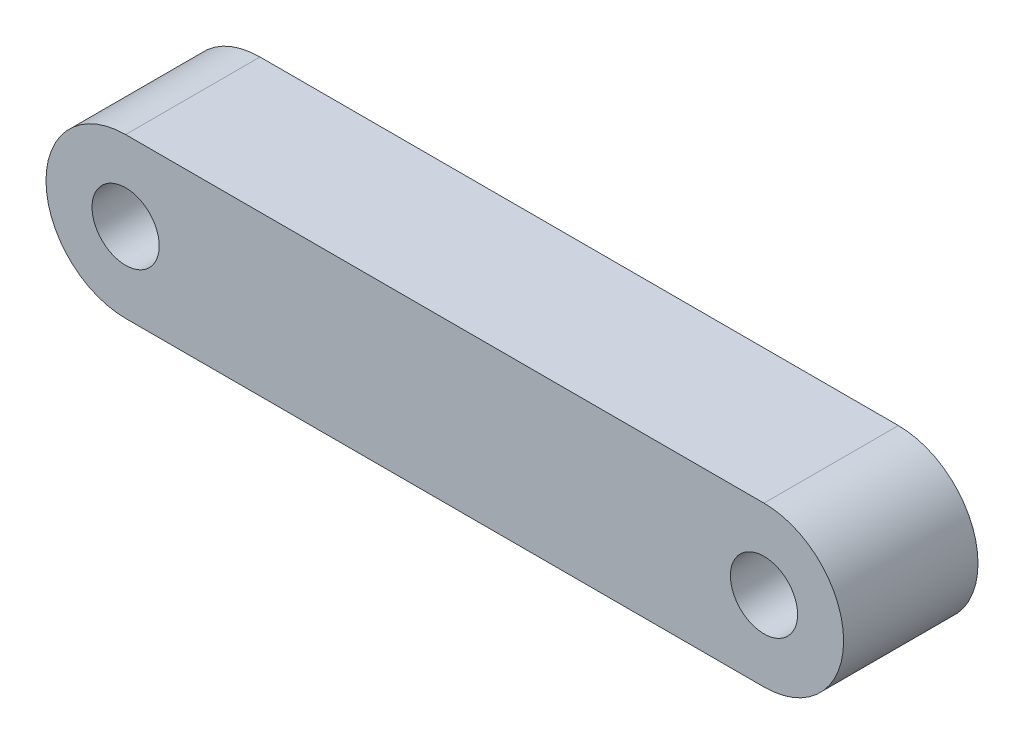
ISO-10303-21;
HEADER;
FILE_DESCRIPTION(('STEP AP214'),'2;1');
FILE_NAME('part.step','',(''),(''),'','','');
FILE_SCHEMA(('AUTOMOTIVE_DESIGN { 1 0 10303 214 1 1 1 1 }'));
ENDSEC;
DATA;
#1=APPLICATION_CONTEXT('core data for automotive mechanical design processes');
#2=APPLICATION_PROTOCOL_DEFINITION('international standard','automotive_design',2000,#1);
#3=PRODUCT_CONTEXT('',#1,'mechanical');
#4=PRODUCT('Part','Part','',(#3));
#5=PRODUCT_RELATED_PRODUCT_CATEGORY('part','',(#4));
#6=PRODUCT_DEFINITION_FORMATION('','',#4);
#7=PRODUCT_DEFINITION_CONTEXT('part definition',#1,'design');
#8=PRODUCT_DEFINITION('design','',#6,#7);
#9=PRODUCT_DEFINITION_SHAPE('','',#8);
#10=(LENGTH_UNIT() NAMED_UNIT(*) SI_UNIT(.MILLI.,.METRE.));
#11=(NAMED_UNIT(*) PLANE_ANGLE_UNIT() SI_UNIT($,.RADIAN.));
#12=(NAMED_UNIT(*) SI_UNIT($,.STERADIAN.) SOLID_ANGLE_UNIT());
#13=UNCERTAINTY_MEASURE_WITH_UNIT(LENGTH_MEASURE(1.E-05),#10,'distance_accuracy_value','');
#14=(GEOMETRIC_REPRESENTATION_CONTEXT(3) GLOBAL_UNCERTAINTY_ASSIGNED_CONTEXT((#13)) GLOBAL_UNIT_ASSIGNED_CONTEXT((#10,
#11,#12)) REPRESENTATION_CONTEXT('',''));
#15=CARTESIAN_POINT('',(0.,0.,0.));
#16=DIRECTION('',(0.,0.,1.));
#17=DIRECTION('',(1.,0.,0.));
#18=AXIS2_PLACEMENT_3D('',#15,#16,#17);
#19=CARTESIAN_POINT('',(-9.07346938775511,0.,4.));
#20=DIRECTION('',(0.,0.,1.));
#21=DIRECTION('',(1.,0.,0.));
#22=AXIS2_PLACEMENT_3D('',#19,#20,#21);
#23=PLANE('',#22);
#24=CARTESIAN_POINT('',(9.92653061224489,0.,4.));
#25=DIRECTION('',(0.,0.,1.));
#26=DIRECTION('',(1.,0.,0.));
#27=AXIS2_PLACEMENT_3D('',#24,#25,#26);
#28=CIRCLE('',#27,1.);
#29=CARTESIAN_POINT('',(10.9265306122449,0.,4.));
#30=VERTEX_POINT('',#29);
#31=EDGE_CURVE('E100',#30,#30,#28,.T.);
#32=ORIENTED_EDGE('',*,*,#31,.F.);
#33=EDGE_LOOP('',(#32));
#34=FACE_BOUND('',#33,.T.);
#35=CARTESIAN_POINT('',(-9.07346938775511,0.,4.));
#36=DIRECTION('',(0.,0.,1.));
#37=DIRECTION('',(1.,0.,0.));
#38=AXIS2_PLACEMENT_3D('',#35,#36,#37);
#39=CIRCLE('',#38,2.37);
#40=CARTESIAN_POINT('',(-9.07346938775511,2.37,4.));
#41=VERTEX_POINT('',#40);
#42=CARTESIAN_POINT('',(-9.07346938775511,-2.37,4.));
#43=VERTEX_POINT('',#42);
#44=EDGE_CURVE('E85',#41,#43,#39,.T.);
#45=ORIENTED_EDGE('',*,*,#44,.T.);
#46=DIRECTION('',(1.,0.,0.));
#47=VECTOR('',#46,1.);
#48=CARTESIAN_POINT('',(-9.07346938775511,-2.37,4.));
#49=LINE('',#48,#47);
#50=CARTESIAN_POINT('',(9.92653061224489,-2.37,4.));
#51=VERTEX_POINT('',#50);
#52=EDGE_CURVE('E80',#43,#51,#49,.T.);
#53=ORIENTED_EDGE('',*,*,#52,.T.);
#54=CARTESIAN_POINT('',(9.92653061224489,0.,4.));
#55=DIRECTION('',(0.,0.,1.));
#56=DIRECTION('',(1.,0.,0.));
#57=AXIS2_PLACEMENT_3D('',#54,#55,#56);
#58=CIRCLE('',#57,2.37);
#59=CARTESIAN_POINT('',(9.92653061224489,2.37,4.));
#60=VERTEX_POINT('',#59);
#61=EDGE_CURVE('E83',#51,#60,#58,.T.);
#62=ORIENTED_EDGE('',*,*,#61,.T.);
#63=DIRECTION('',(-1.,0.,0.));
#64=VECTOR('',#63,1.);
#65=CARTESIAN_POINT('',(-9.07346938775511,2.37,4.));
#66=LINE('',#65,#64);
#67=EDGE_CURVE('E50',#60,#41,#66,.T.);
#68=ORIENTED_EDGE('',*,*,#67,.T.);
#69=EDGE_LOOP('',(#45,#53,#62,#68));
#70=FACE_BOUND('',#69,.T.);
#71=CARTESIAN_POINT('',(-9.07346938775511,0.,4.));
#72=DIRECTION('',(0.,0.,1.));
#73=DIRECTION('',(1.,0.,0.));
#74=AXIS2_PLACEMENT_3D('',#71,#72,#73);
#75=CIRCLE('',#74,1.);
#76=CARTESIAN_POINT('',(-8.07346938775511,0.,4.));
#77=VERTEX_POINT('',#76);
#78=EDGE_CURVE('E115',#77,#77,#75,.T.);
#79=ORIENTED_EDGE('',*,*,#78,.F.);
#80=EDGE_LOOP('',(#79));
#81=FACE_BOUND('',#80,.T.);
#82=ADVANCED_FACE('F33',(#34,#70,#81),#23,.T.);
#83=CARTESIAN_POINT('',(-9.07346938775511,0.,0.));
#84=DIRECTION('',(0.,0.,1.));
#85=DIRECTION('',(1.,0.,0.));
#86=AXIS2_PLACEMENT_3D('',#83,#84,#85);
#87=PLANE('',#86);
#88=CARTESIAN_POINT('',(-9.07346938775511,0.,0.));
#89=DIRECTION('',(0.,0.,1.));
#90=DIRECTION('',(1.,0.,0.));
#91=AXIS2_PLACEMENT_3D('',#88,#89,#90);
#92=CIRCLE('',#91,2.37);
#93=CARTESIAN_POINT('',(-9.07346938775511,2.37,0.));
#94=VERTEX_POINT('',#93);
#95=CARTESIAN_POINT('',(-9.07346938775511,-2.37,0.));
#96=VERTEX_POINT('',#95);
#97=EDGE_CURVE('E97',#94,#96,#92,.T.);
#98=ORIENTED_EDGE('',*,*,#97,.F.);
#99=DIRECTION('',(-1.,0.,0.));
#100=VECTOR('',#99,1.);
#101=CARTESIAN_POINT('',(-9.07346938775511,2.37,0.));
#102=LINE('',#101,#100);
#103=CARTESIAN_POINT('',(9.92653061224489,2.37,0.));
#104=VERTEX_POINT('',#103);
#105=EDGE_CURVE('E73',#104,#94,#102,.T.);
#106=ORIENTED_EDGE('',*,*,#105,.F.);
#107=CARTESIAN_POINT('',(9.92653061224489,0.,0.));
#108=DIRECTION('',(0.,0.,1.));
#109=DIRECTION('',(1.,0.,0.));
#110=AXIS2_PLACEMENT_3D('',#107,#108,#109);
#111=CIRCLE('',#110,2.37);
#112=CARTESIAN_POINT('',(9.92653061224489,-2.37,0.));
#113=VERTEX_POINT('',#112);
#114=EDGE_CURVE('E67',#113,#104,#111,.T.);
#115=ORIENTED_EDGE('',*,*,#114,.F.);
#116=DIRECTION('',(1.,0.,0.));
#117=VECTOR('',#116,1.);
#118=CARTESIAN_POINT('',(-9.07346938775511,-2.37,0.));
#119=LINE('',#118,#117);
#120=EDGE_CURVE('E89',#96,#113,#119,.T.);
#121=ORIENTED_EDGE('',*,*,#120,.F.);
#122=EDGE_LOOP('',(#98,#106,#115,#121));
#123=FACE_BOUND('',#122,.T.);
#124=CARTESIAN_POINT('',(9.92653061224489,0.,0.));
#125=DIRECTION('',(0.,0.,1.));
#126=DIRECTION('',(1.,0.,0.));
#127=AXIS2_PLACEMENT_3D('',#124,#125,#126);
#128=CIRCLE('',#127,1.);
#129=CARTESIAN_POINT('',(10.9265306122449,0.,0.));
#130=VERTEX_POINT('',#129);
#131=EDGE_CURVE('E112',#130,#130,#128,.T.);
#132=ORIENTED_EDGE('',*,*,#131,.T.);
#133=EDGE_LOOP('',(#132));
#134=FACE_BOUND('',#133,.T.);
#135=CARTESIAN_POINT('',(-9.07346938775511,0.,0.));
#136=DIRECTION('',(0.,0.,1.));
#137=DIRECTION('',(1.,0.,0.));
#138=AXIS2_PLACEMENT_3D('',#135,#136,#137);
#139=CIRCLE('',#138,1.);
#140=CARTESIAN_POINT('',(-8.07346938775511,0.,0.));
#141=VERTEX_POINT('',#140);
#142=EDGE_CURVE('E118',#141,#141,#139,.T.);
#143=ORIENTED_EDGE('',*,*,#142,.T.);
#144=EDGE_LOOP('',(#143));
#145=FACE_BOUND('',#144,.T.);
#146=ADVANCED_FACE('F108',(#123,#134,#145),#87,.F.);
#147=CARTESIAN_POINT('',(-9.07346938775511,0.,4.));
#148=DIRECTION('',(0.,0.,-1.));
#149=DIRECTION('',(-1.,0.,0.));
#150=AXIS2_PLACEMENT_3D('',#147,#148,#149);
#151=CYLINDRICAL_SURFACE('',#150,2.37);
#152=ORIENTED_EDGE('',*,*,#97,.T.);
#153=DIRECTION('',(0.,0.,-1.));
#154=VECTOR('',#153,1.);
#155=CARTESIAN_POINT('',(-9.07346938775511,-2.37,4.));
#156=LINE('',#155,#154);
#157=EDGE_CURVE('E11',#43,#96,#156,.T.);
#158=ORIENTED_EDGE('',*,*,#157,.F.);
#159=ORIENTED_EDGE('',*,*,#44,.F.);
#160=DIRECTION('',(0.,0.,-1.));
#161=VECTOR('',#160,1.);
#162=CARTESIAN_POINT('',(-9.07346938775511,2.37,4.));
#163=LINE('',#162,#161);
#164=EDGE_CURVE('E93',#41,#94,#163,.T.);
#165=ORIENTED_EDGE('',*,*,#164,.T.);
#166=EDGE_LOOP('',(#152,#158,#159,#165));
#167=FACE_BOUND('',#166,.T.);
#168=ADVANCED_FACE('F35',(#167),#151,.T.);
#169=CARTESIAN_POINT('',(-9.07346938775511,-2.37,4.));
#170=DIRECTION('',(0.,1.,0.));
#171=DIRECTION('',(0.,0.,1.));
#172=AXIS2_PLACEMENT_3D('',#169,#170,#171);
#173=PLANE('',#172);
#174=ORIENTED_EDGE('',*,*,#120,.T.);
#175=DIRECTION('',(0.,0.,-1.));
#176=VECTOR('',#175,1.);
#177=CARTESIAN_POINT('',(9.92653061224489,-2.37,4.));
#178=LINE('',#177,#176);
#179=EDGE_CURVE('E42',#51,#113,#178,.T.);
#180=ORIENTED_EDGE('',*,*,#179,.F.);
#181=ORIENTED_EDGE('',*,*,#52,.F.);
#182=ORIENTED_EDGE('',*,*,#157,.T.);
#183=EDGE_LOOP('',(#174,#180,#181,#182));
#184=FACE_BOUND('',#183,.T.);
#185=ADVANCED_FACE('F88',(#184),#173,.F.);
#186=CARTESIAN_POINT('',(9.92653061224489,0.,4.));
#187=DIRECTION('',(0.,0.,-1.));
#188=DIRECTION('',(-1.,0.,0.));
#189=AXIS2_PLACEMENT_3D('',#186,#187,#188);
#190=CYLINDRICAL_SURFACE('',#189,2.37);
#191=ORIENTED_EDGE('',*,*,#114,.T.);
#192=DIRECTION('',(0.,0.,-1.));
#193=VECTOR('',#192,1.);
#194=CARTESIAN_POINT('',(9.92653061224489,2.37,4.));
#195=LINE('',#194,#193);
#196=EDGE_CURVE('E90',#60,#104,#195,.T.);
#197=ORIENTED_EDGE('',*,*,#196,.F.);
#198=ORIENTED_EDGE('',*,*,#61,.F.);
#199=ORIENTED_EDGE('',*,*,#179,.T.);
#200=EDGE_LOOP('',(#191,#197,#198,#199));
#201=FACE_BOUND('',#200,.T.);
#202=ADVANCED_FACE('F91',(#201),#190,.T.);
#203=CARTESIAN_POINT('',(-9.07346938775511,2.37,4.));
#204=DIRECTION('',(0.,-1.,0.));
#205=DIRECTION('',(0.,0.,-1.));
#206=AXIS2_PLACEMENT_3D('',#203,#204,#205);
#207=PLANE('',#206);
#208=ORIENTED_EDGE('',*,*,#105,.T.);
#209=ORIENTED_EDGE('',*,*,#164,.F.);
#210=ORIENTED_EDGE('',*,*,#67,.F.);
#211=ORIENTED_EDGE('',*,*,#196,.T.);
#212=EDGE_LOOP('',(#208,#209,#210,#211));
#213=FACE_BOUND('',#212,.T.);
#214=ADVANCED_FACE('F105',(#213),#207,.F.);
#215=CARTESIAN_POINT('',(9.92653061224489,0.,4.));
#216=DIRECTION('',(0.,0.,-1.));
#217=DIRECTION('',(-1.,0.,0.));
#218=AXIS2_PLACEMENT_3D('',#215,#216,#217);
#219=CYLINDRICAL_SURFACE('',#218,1.);
#220=ORIENTED_EDGE('',*,*,#31,.T.);
#221=EDGE_LOOP('',(#220));
#222=FACE_BOUND('',#221,.T.);
#223=ORIENTED_EDGE('',*,*,#131,.F.);
#224=EDGE_LOOP('',(#223));
#225=FACE_BOUND('',#224,.T.);
#226=ADVANCED_FACE('F135',(#222,#225),#219,.F.);
#227=CARTESIAN_POINT('',(-9.07346938775511,0.,4.));
#228=DIRECTION('',(0.,0.,-1.));
#229=DIRECTION('',(-1.,0.,0.));
#230=AXIS2_PLACEMENT_3D('',#227,#228,#229);
#231=CYLINDRICAL_SURFACE('',#230,1.);
#232=ORIENTED_EDGE('',*,*,#78,.T.);
#233=EDGE_LOOP('',(#232));
#234=FACE_BOUND('',#233,.T.);
#235=ORIENTED_EDGE('',*,*,#142,.F.);
#236=EDGE_LOOP('',(#235));
#237=FACE_BOUND('',#236,.T.);
#238=ADVANCED_FACE('F124',(#234,#237),#231,.F.);
#239=CLOSED_SHELL('',(#82,#146,#168,#185,#202,#214,#226,#238));
#240=MANIFOLD_SOLID_BREP('B2',#239);
#241=ADVANCED_BREP_SHAPE_REPRESENTATION('',(#18,#240),#14);
#242=SHAPE_DEFINITION_REPRESENTATION(#9,#241);
ENDSEC;
END-ISO-10303-21;
